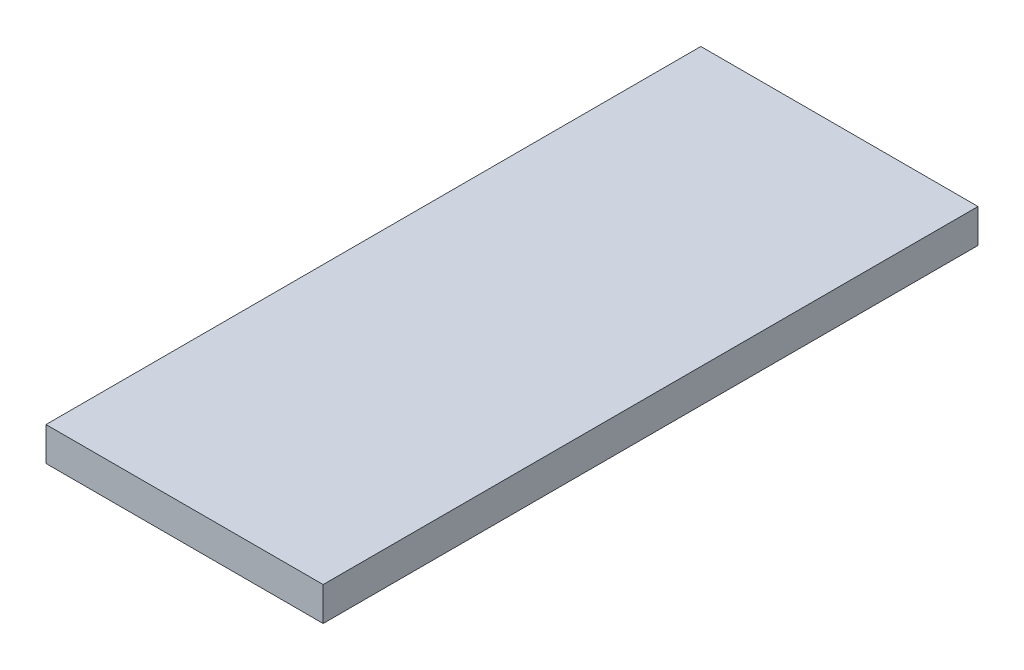
ISO-10303-21;
HEADER;
FILE_DESCRIPTION(('STEP AP214'),'2;1');
FILE_NAME('part.step','',(''),(''),'','','');
FILE_SCHEMA(('AUTOMOTIVE_DESIGN { 1 0 10303 214 1 1 1 1 }'));
ENDSEC;
DATA;
#1=APPLICATION_CONTEXT('core data for automotive mechanical design processes');
#2=APPLICATION_PROTOCOL_DEFINITION('international standard','automotive_design',2000,#1);
#3=PRODUCT_CONTEXT('',#1,'mechanical');
#4=PRODUCT('Part','Part','',(#3));
#5=PRODUCT_RELATED_PRODUCT_CATEGORY('part','',(#4));
#6=PRODUCT_DEFINITION_FORMATION('','',#4);
#7=PRODUCT_DEFINITION_CONTEXT('part definition',#1,'design');
#8=PRODUCT_DEFINITION('design','',#6,#7);
#9=PRODUCT_DEFINITION_SHAPE('','',#8);
#10=(LENGTH_UNIT() NAMED_UNIT(*) SI_UNIT(.MILLI.,.METRE.));
#11=(NAMED_UNIT(*) PLANE_ANGLE_UNIT() SI_UNIT($,.RADIAN.));
#12=(NAMED_UNIT(*) SI_UNIT($,.STERADIAN.) SOLID_ANGLE_UNIT());
#13=UNCERTAINTY_MEASURE_WITH_UNIT(LENGTH_MEASURE(1.E-05),#10,'distance_accuracy_value','');
#14=(GEOMETRIC_REPRESENTATION_CONTEXT(3) GLOBAL_UNCERTAINTY_ASSIGNED_CONTEXT((#13)) GLOBAL_UNIT_ASSIGNED_CONTEXT((#10,
#11,#12)) REPRESENTATION_CONTEXT('',''));
#15=CARTESIAN_POINT('',(0.,0.,0.));
#16=DIRECTION('',(0.,0.,1.));
#17=DIRECTION('',(1.,0.,0.));
#18=AXIS2_PLACEMENT_3D('',#15,#16,#17);
#19=CARTESIAN_POINT('',(1230.,-230.,2150.));
#20=DIRECTION('',(1.,0.,0.));
#21=DIRECTION('',(0.,0.,-1.));
#22=AXIS2_PLACEMENT_3D('',#19,#20,#21);
#23=PLANE('',#22);
#24=DIRECTION('',(0.,-1.,0.));
#25=VECTOR('',#24,1.);
#26=CARTESIAN_POINT('',(1230.,-230.,-2150.));
#27=LINE('',#26,#25);
#28=CARTESIAN_POINT('',(1230.,-8.29875720137643,-2150.));
#29=VERTEX_POINT('',#28);
#30=CARTESIAN_POINT('',(1230.,-230.,-2150.));
#31=VERTEX_POINT('',#30);
#32=EDGE_CURVE('E105',#29,#31,#27,.T.);
#33=ORIENTED_EDGE('',*,*,#32,.T.);
#34=DIRECTION('',(0.,0.,-1.));
#35=VECTOR('',#34,1.);
#36=CARTESIAN_POINT('',(1230.,-230.,2150.));
#37=LINE('',#36,#35);
#38=CARTESIAN_POINT('',(1230.,-230.,2150.));
#39=VERTEX_POINT('',#38);
#40=EDGE_CURVE('E11',#39,#31,#37,.T.);
#41=ORIENTED_EDGE('',*,*,#40,.F.);
#42=DIRECTION('',(0.,-1.,0.));
#43=VECTOR('',#42,1.);
#44=CARTESIAN_POINT('',(1230.,-230.,2150.));
#45=LINE('',#44,#43);
#46=CARTESIAN_POINT('',(1230.,-8.29875720137643,2150.));
#47=VERTEX_POINT('',#46);
#48=EDGE_CURVE('E89',#47,#39,#45,.T.);
#49=ORIENTED_EDGE('',*,*,#48,.F.);
#50=DIRECTION('',(0.,0.,-1.));
#51=VECTOR('',#50,1.);
#52=CARTESIAN_POINT('',(1230.,-8.29875720137643,2150.));
#53=LINE('',#52,#51);
#54=EDGE_CURVE('E98',#47,#29,#53,.T.);
#55=ORIENTED_EDGE('',*,*,#54,.T.);
#56=EDGE_LOOP('',(#33,#41,#49,#55));
#57=FACE_BOUND('',#56,.T.);
#58=ADVANCED_FACE('F39',(#57),#23,.F.);
#59=CARTESIAN_POINT('',(1230.,-230.,2150.));
#60=DIRECTION('',(0.,1.,0.));
#61=DIRECTION('',(0.,0.,1.));
#62=AXIS2_PLACEMENT_3D('',#59,#60,#61);
#63=PLANE('',#62);
#64=DIRECTION('',(1.,0.,0.));
#65=VECTOR('',#64,1.);
#66=CARTESIAN_POINT('',(1230.,-230.,-2150.));
#67=LINE('',#66,#65);
#68=CARTESIAN_POINT('',(3050.,-230.,-2150.));
#69=VERTEX_POINT('',#68);
#70=EDGE_CURVE('E94',#31,#69,#67,.T.);
#71=ORIENTED_EDGE('',*,*,#70,.T.);
#72=DIRECTION('',(0.,0.,-1.));
#73=VECTOR('',#72,1.);
#74=CARTESIAN_POINT('',(3050.,-230.,2150.));
#75=LINE('',#74,#73);
#76=CARTESIAN_POINT('',(3050.,-230.,2150.));
#77=VERTEX_POINT('',#76);
#78=EDGE_CURVE('E50',#77,#69,#75,.T.);
#79=ORIENTED_EDGE('',*,*,#78,.F.);
#80=DIRECTION('',(1.,0.,0.));
#81=VECTOR('',#80,1.);
#82=CARTESIAN_POINT('',(1230.,-230.,2150.));
#83=LINE('',#82,#81);
#84=EDGE_CURVE('E83',#39,#77,#83,.T.);
#85=ORIENTED_EDGE('',*,*,#84,.F.);
#86=ORIENTED_EDGE('',*,*,#40,.T.);
#87=EDGE_LOOP('',(#71,#79,#85,#86));
#88=FACE_BOUND('',#87,.T.);
#89=ADVANCED_FACE('F91',(#88),#63,.F.);
#90=CARTESIAN_POINT('',(3050.,-230.,2150.));
#91=DIRECTION('',(-1.,0.,0.));
#92=DIRECTION('',(0.,0.,1.));
#93=AXIS2_PLACEMENT_3D('',#90,#91,#92);
#94=PLANE('',#93);
#95=DIRECTION('',(0.,1.,0.));
#96=VECTOR('',#95,1.);
#97=CARTESIAN_POINT('',(3050.,-230.,-2150.));
#98=LINE('',#97,#96);
#99=CARTESIAN_POINT('',(3050.,-8.29875720137643,-2150.));
#100=VERTEX_POINT('',#99);
#101=EDGE_CURVE('E75',#69,#100,#98,.T.);
#102=ORIENTED_EDGE('',*,*,#101,.T.);
#103=DIRECTION('',(0.,0.,-1.));
#104=VECTOR('',#103,1.);
#105=CARTESIAN_POINT('',(3050.,-8.29875720137643,2150.));
#106=LINE('',#105,#104);
#107=CARTESIAN_POINT('',(3050.,-8.29875720137643,2150.));
#108=VERTEX_POINT('',#107);
#109=EDGE_CURVE('E92',#108,#100,#106,.T.);
#110=ORIENTED_EDGE('',*,*,#109,.F.);
#111=DIRECTION('',(0.,1.,0.));
#112=VECTOR('',#111,1.);
#113=CARTESIAN_POINT('',(3050.,-230.,2150.));
#114=LINE('',#113,#112);
#115=EDGE_CURVE('E86',#77,#108,#114,.T.);
#116=ORIENTED_EDGE('',*,*,#115,.F.);
#117=ORIENTED_EDGE('',*,*,#78,.T.);
#118=EDGE_LOOP('',(#102,#110,#116,#117));
#119=FACE_BOUND('',#118,.T.);
#120=ADVANCED_FACE('F96',(#119),#94,.F.);
#121=CARTESIAN_POINT('',(1230.,-8.29875720137643,2150.));
#122=DIRECTION('',(0.,-1.,0.));
#123=DIRECTION('',(0.,0.,-1.));
#124=AXIS2_PLACEMENT_3D('',#121,#122,#123);
#125=PLANE('',#124);
#126=DIRECTION('',(-1.,0.,0.));
#127=VECTOR('',#126,1.);
#128=CARTESIAN_POINT('',(1230.,-8.29875720137643,-2150.));
#129=LINE('',#128,#127);
#130=EDGE_CURVE('E79',#100,#29,#129,.T.);
#131=ORIENTED_EDGE('',*,*,#130,.T.);
#132=ORIENTED_EDGE('',*,*,#54,.F.);
#133=DIRECTION('',(-1.,0.,0.));
#134=VECTOR('',#133,1.);
#135=CARTESIAN_POINT('',(1230.,-8.29875720137643,2150.));
#136=LINE('',#135,#134);
#137=EDGE_CURVE('E54',#108,#47,#136,.T.);
#138=ORIENTED_EDGE('',*,*,#137,.F.);
#139=ORIENTED_EDGE('',*,*,#109,.T.);
#140=EDGE_LOOP('',(#131,#132,#138,#139));
#141=FACE_BOUND('',#140,.T.);
#142=ADVANCED_FACE('F108',(#141),#125,.F.);
#143=CARTESIAN_POINT('',(0.,0.,2150.));
#144=DIRECTION('',(0.,0.,-1.));
#145=DIRECTION('',(-1.,0.,0.));
#146=AXIS2_PLACEMENT_3D('',#143,#144,#145);
#147=PLANE('',#146);
#148=ORIENTED_EDGE('',*,*,#48,.T.);
#149=ORIENTED_EDGE('',*,*,#84,.T.);
#150=ORIENTED_EDGE('',*,*,#115,.T.);
#151=ORIENTED_EDGE('',*,*,#137,.T.);
#152=EDGE_LOOP('',(#148,#149,#150,#151));
#153=FACE_BOUND('',#152,.T.);
#154=ADVANCED_FACE('F88',(#153),#147,.F.);
#155=CARTESIAN_POINT('',(0.,0.,-2150.));
#156=DIRECTION('',(0.,0.,-1.));
#157=DIRECTION('',(-1.,0.,0.));
#158=AXIS2_PLACEMENT_3D('',#155,#156,#157);
#159=PLANE('',#158);
#160=ORIENTED_EDGE('',*,*,#32,.F.);
#161=ORIENTED_EDGE('',*,*,#130,.F.);
#162=ORIENTED_EDGE('',*,*,#101,.F.);
#163=ORIENTED_EDGE('',*,*,#70,.F.);
#164=EDGE_LOOP('',(#160,#161,#162,#163));
#165=FACE_BOUND('',#164,.T.);
#166=ADVANCED_FACE('F115',(#165),#159,.T.);
#167=CLOSED_SHELL('',(#58,#89,#120,#142,#154,#166));
#168=MANIFOLD_SOLID_BREP('B2',#167);
#169=ADVANCED_BREP_SHAPE_REPRESENTATION('',(#18,#168),#14);
#170=SHAPE_DEFINITION_REPRESENTATION(#9,#169);
ENDSEC;
END-ISO-10303-21;
